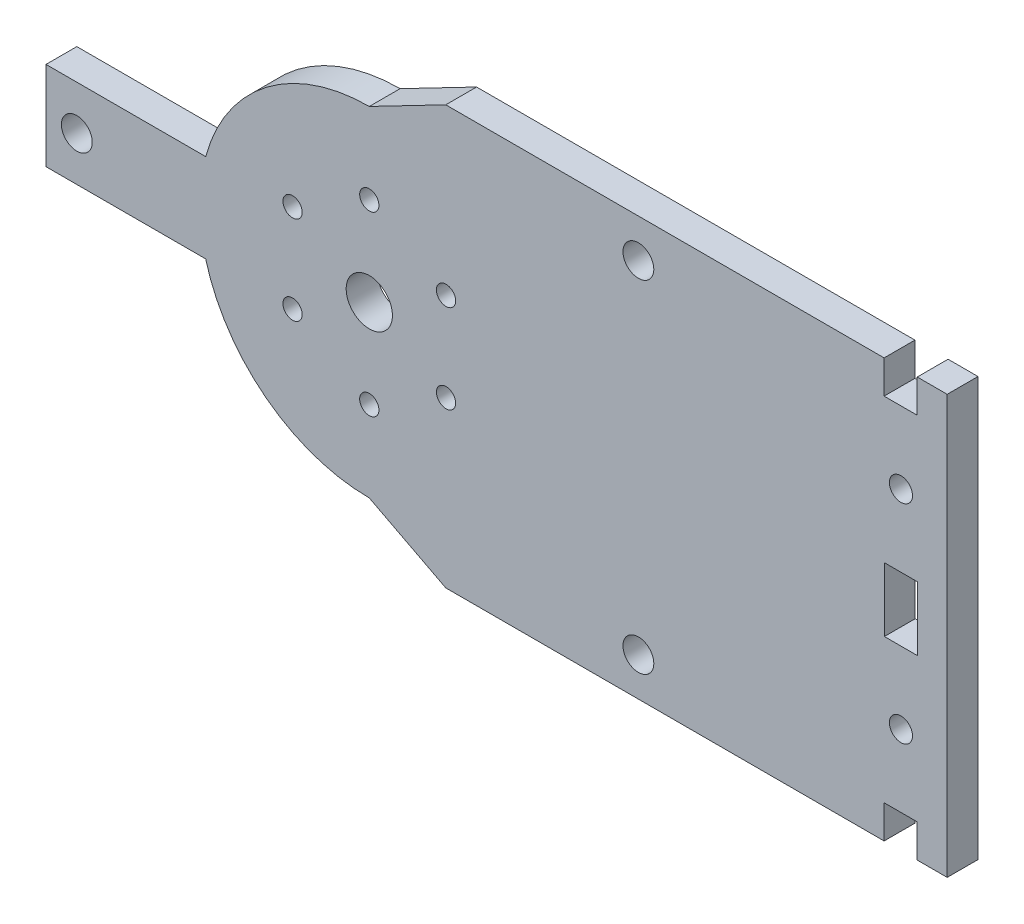
ISO-10303-21;
HEADER;
FILE_DESCRIPTION(('STEP AP214'),'2;1');
FILE_NAME('part.step','',(''),(''),'','','');
FILE_SCHEMA(('AUTOMOTIVE_DESIGN { 1 0 10303 214 1 1 1 1 }'));
ENDSEC;
DATA;
#1=APPLICATION_CONTEXT('core data for automotive mechanical design processes');
#2=APPLICATION_PROTOCOL_DEFINITION('international standard','automotive_design',2000,#1);
#3=PRODUCT_CONTEXT('',#1,'mechanical');
#4=PRODUCT('Part','Part','',(#3));
#5=PRODUCT_RELATED_PRODUCT_CATEGORY('part','',(#4));
#6=PRODUCT_DEFINITION_FORMATION('','',#4);
#7=PRODUCT_DEFINITION_CONTEXT('part definition',#1,'design');
#8=PRODUCT_DEFINITION('design','',#6,#7);
#9=PRODUCT_DEFINITION_SHAPE('','',#8);
#10=(LENGTH_UNIT() NAMED_UNIT(*) SI_UNIT(.MILLI.,.METRE.));
#11=(NAMED_UNIT(*) PLANE_ANGLE_UNIT() SI_UNIT($,.RADIAN.));
#12=(NAMED_UNIT(*) SI_UNIT($,.STERADIAN.) SOLID_ANGLE_UNIT());
#13=UNCERTAINTY_MEASURE_WITH_UNIT(LENGTH_MEASURE(1.E-05),#10,'distance_accuracy_value','');
#14=(GEOMETRIC_REPRESENTATION_CONTEXT(3) GLOBAL_UNCERTAINTY_ASSIGNED_CONTEXT((#13)) GLOBAL_UNIT_ASSIGNED_CONTEXT((#10,
#11,#12)) REPRESENTATION_CONTEXT('',''));
#15=CARTESIAN_POINT('',(0.,0.,0.));
#16=DIRECTION('',(0.,0.,1.));
#17=DIRECTION('',(1.,0.,0.));
#18=AXIS2_PLACEMENT_3D('',#15,#16,#17);
#19=CARTESIAN_POINT('',(-38.9989951683486,0.,4.));
#20=DIRECTION('',(0.,0.,-1.));
#21=DIRECTION('',(-1.,0.,0.));
#22=AXIS2_PLACEMENT_3D('',#19,#20,#21);
#23=PLANE('',#22);
#24=CARTESIAN_POINT('',(30.0010048316515,13.5,4.));
#25=DIRECTION('',(0.,0.,1.));
#26=DIRECTION('',(1.,0.,0.));
#27=AXIS2_PLACEMENT_3D('',#24,#25,#26);
#28=CIRCLE('',#27,1.49999999999999);
#29=CARTESIAN_POINT('',(31.5010048316515,13.5,4.));
#30=VERTEX_POINT('',#29);
#31=EDGE_CURVE('E223',#30,#30,#28,.T.);
#32=ORIENTED_EDGE('',*,*,#31,.F.);
#33=EDGE_LOOP('',(#32));
#34=FACE_BOUND('',#33,.T.);
#35=DIRECTION('',(1.,0.,0.));
#36=VECTOR('',#35,1.);
#37=CARTESIAN_POINT('',(27.8157078564777,-27.1499999999999,4.));
#38=LINE('',#37,#36);
#39=CARTESIAN_POINT('',(-29.0750000000013,-27.1499999999999,4.));
#40=VERTEX_POINT('',#39);
#41=CARTESIAN_POINT('',(27.8157078564777,-27.1499999999999,4.));
#42=VERTEX_POINT('',#41);
#43=EDGE_CURVE('E229',#40,#42,#38,.T.);
#44=ORIENTED_EDGE('',*,*,#43,.T.);
#45=DIRECTION('',(0.,1.,0.));
#46=VECTOR('',#45,1.);
#47=CARTESIAN_POINT('',(27.8157078564777,-27.1499999999999,4.));
#48=LINE('',#47,#46);
#49=CARTESIAN_POINT('',(27.8157078564777,-22.8499999999999,4.));
#50=VERTEX_POINT('',#49);
#51=EDGE_CURVE('E232',#42,#50,#48,.T.);
#52=ORIENTED_EDGE('',*,*,#51,.T.);
#53=DIRECTION('',(1.,0.,0.));
#54=VECTOR('',#53,1.);
#55=CARTESIAN_POINT('',(27.8157078564777,-22.8499999999999,4.));
#56=LINE('',#55,#54);
#57=CARTESIAN_POINT('',(32.1157078564777,-22.8499999999999,4.));
#58=VERTEX_POINT('',#57);
#59=EDGE_CURVE('E235',#50,#58,#56,.T.);
#60=ORIENTED_EDGE('',*,*,#59,.T.);
#61=DIRECTION('',(0.,-1.,0.));
#62=VECTOR('',#61,1.);
#63=CARTESIAN_POINT('',(32.1157078564777,-27.1499999999999,4.));
#64=LINE('',#63,#62);
#65=CARTESIAN_POINT('',(32.1157078564777,-27.1499999999999,4.));
#66=VERTEX_POINT('',#65);
#67=EDGE_CURVE('E237',#58,#66,#64,.T.);
#68=ORIENTED_EDGE('',*,*,#67,.T.);
#69=DIRECTION('',(1.,0.,0.));
#70=VECTOR('',#69,1.);
#71=CARTESIAN_POINT('',(32.1157078564777,-27.1499999999999,4.));
#72=LINE('',#71,#70);
#73=CARTESIAN_POINT('',(36.0010048316514,-27.1499999999999,4.));
#74=VERTEX_POINT('',#73);
#75=EDGE_CURVE('E239',#66,#74,#72,.T.);
#76=ORIENTED_EDGE('',*,*,#75,.T.);
#77=DIRECTION('',(0.,1.,0.));
#78=VECTOR('',#77,1.);
#79=CARTESIAN_POINT('',(36.0010048316514,-27.1499999999999,4.));
#80=LINE('',#79,#78);
#81=CARTESIAN_POINT('',(36.0010048316514,27.1499999999999,4.));
#82=VERTEX_POINT('',#81);
#83=EDGE_CURVE('E241',#74,#82,#80,.T.);
#84=ORIENTED_EDGE('',*,*,#83,.T.);
#85=DIRECTION('',(-1.,0.,0.));
#86=VECTOR('',#85,1.);
#87=CARTESIAN_POINT('',(36.0010048316514,27.1499999999999,4.));
#88=LINE('',#87,#86);
#89=CARTESIAN_POINT('',(32.1157078564777,27.1499999999999,4.));
#90=VERTEX_POINT('',#89);
#91=EDGE_CURVE('E243',#82,#90,#88,.T.);
#92=ORIENTED_EDGE('',*,*,#91,.T.);
#93=DIRECTION('',(0.,-1.,0.));
#94=VECTOR('',#93,1.);
#95=CARTESIAN_POINT('',(32.1157078564777,27.1499999999999,4.));
#96=LINE('',#95,#94);
#97=CARTESIAN_POINT('',(32.1157078564777,22.8499999999999,4.));
#98=VERTEX_POINT('',#97);
#99=EDGE_CURVE('E245',#90,#98,#96,.T.);
#100=ORIENTED_EDGE('',*,*,#99,.T.);
#101=DIRECTION('',(-1.,0.,0.));
#102=VECTOR('',#101,1.);
#103=CARTESIAN_POINT('',(27.8157078564777,22.8499999999999,4.));
#104=LINE('',#103,#102);
#105=CARTESIAN_POINT('',(27.8157078564777,22.8499999999999,4.));
#106=VERTEX_POINT('',#105);
#107=EDGE_CURVE('E247',#98,#106,#104,.T.);
#108=ORIENTED_EDGE('',*,*,#107,.T.);
#109=DIRECTION('',(0.,1.,0.));
#110=VECTOR('',#109,1.);
#111=CARTESIAN_POINT('',(27.8157078564777,27.1499999999999,4.));
#112=LINE('',#111,#110);
#113=CARTESIAN_POINT('',(27.8157078564777,27.1499999999999,4.));
#114=VERTEX_POINT('',#113);
#115=EDGE_CURVE('E249',#106,#114,#112,.T.);
#116=ORIENTED_EDGE('',*,*,#115,.T.);
#117=DIRECTION('',(-1.,0.,0.));
#118=VECTOR('',#117,1.);
#119=CARTESIAN_POINT('',(-29.0750000000013,27.1499999999999,4.));
#120=LINE('',#119,#118);
#121=CARTESIAN_POINT('',(-29.0750000000013,27.1499999999999,4.));
#122=VERTEX_POINT('',#121);
#123=EDGE_CURVE('E251',#114,#122,#120,.T.);
#124=ORIENTED_EDGE('',*,*,#123,.T.);
#125=DIRECTION('',(-0.887673551634124,-0.460473306207059,0.));
#126=VECTOR('',#125,1.);
#127=CARTESIAN_POINT('',(-38.9989951683486,22.0020096633054,4.));
#128=LINE('',#127,#126);
#129=CARTESIAN_POINT('',(-38.9989951683486,22.0020096633054,4.));
#130=VERTEX_POINT('',#129);
#131=EDGE_CURVE('E253',#122,#130,#128,.T.);
#132=ORIENTED_EDGE('',*,*,#131,.T.);
#133=CARTESIAN_POINT('',(-38.9989951683486,0.,4.));
#134=DIRECTION('',(0.,0.,1.));
#135=DIRECTION('',(-1.,0.,0.));
#136=AXIS2_PLACEMENT_3D('',#133,#134,#135);
#137=CIRCLE('',#136,22.0020096633054);
#138=CARTESIAN_POINT('',(-60.2363662209103,5.75000000000001,4.));
#139=VERTEX_POINT('',#138);
#140=EDGE_CURVE('E255',#130,#139,#137,.T.);
#141=ORIENTED_EDGE('',*,*,#140,.T.);
#142=DIRECTION('',(-1.,0.,0.));
#143=VECTOR('',#142,1.);
#144=CARTESIAN_POINT('',(-60.2363662209103,5.75000000000001,4.));
#145=LINE('',#144,#143);
#146=CARTESIAN_POINT('',(-80.9582873118696,5.75,4.));
#147=VERTEX_POINT('',#146);
#148=EDGE_CURVE('E257',#139,#147,#145,.T.);
#149=ORIENTED_EDGE('',*,*,#148,.T.);
#150=DIRECTION('',(0.,-1.,0.));
#151=VECTOR('',#150,1.);
#152=CARTESIAN_POINT('',(-80.9582873118696,5.75,4.));
#153=LINE('',#152,#151);
#154=CARTESIAN_POINT('',(-80.9582873118696,-5.75,4.));
#155=VERTEX_POINT('',#154);
#156=EDGE_CURVE('E259',#147,#155,#153,.T.);
#157=ORIENTED_EDGE('',*,*,#156,.T.);
#158=DIRECTION('',(1.,0.,0.));
#159=VECTOR('',#158,1.);
#160=CARTESIAN_POINT('',(-80.9582873118696,-5.75,4.));
#161=LINE('',#160,#159);
#162=CARTESIAN_POINT('',(-60.2363662209103,-5.75000000000001,4.));
#163=VERTEX_POINT('',#162);
#164=EDGE_CURVE('E261',#155,#163,#161,.T.);
#165=ORIENTED_EDGE('',*,*,#164,.T.);
#166=CARTESIAN_POINT('',(-38.9989951683486,0.,4.));
#167=DIRECTION('',(0.,0.,1.));
#168=DIRECTION('',(-1.,0.,0.));
#169=AXIS2_PLACEMENT_3D('',#166,#167,#168);
#170=CIRCLE('',#169,22.0020096633054);
#171=CARTESIAN_POINT('',(-38.9989951683486,-22.0020096633054,4.));
#172=VERTEX_POINT('',#171);
#173=EDGE_CURVE('E263',#163,#172,#170,.T.);
#174=ORIENTED_EDGE('',*,*,#173,.T.);
#175=DIRECTION('',(0.887673551634124,-0.46047330620706,0.));
#176=VECTOR('',#175,1.);
#177=CARTESIAN_POINT('',(-38.9989951683486,-22.0020096633054,4.));
#178=LINE('',#177,#176);
#179=EDGE_CURVE('E265',#172,#40,#178,.T.);
#180=ORIENTED_EDGE('',*,*,#179,.T.);
#181=EDGE_LOOP('',(#44,#52,#60,#68,#76,#84,#92,#100,#108,#116,#124,#132,#141,#149,#157,#165,
#174,#180));
#182=FACE_BOUND('',#181,.T.);
#183=DIRECTION('',(0.,-1.,0.));
#184=VECTOR('',#183,1.);
#185=CARTESIAN_POINT('',(27.8510048316515,-4.15,4.));
#186=LINE('',#185,#184);
#187=CARTESIAN_POINT('',(27.8510048316515,4.15,4.));
#188=VERTEX_POINT('',#187);
#189=CARTESIAN_POINT('',(27.8510048316515,-4.15,4.));
#190=VERTEX_POINT('',#189);
#191=EDGE_CURVE('E184',#188,#190,#186,.T.);
#192=ORIENTED_EDGE('',*,*,#191,.F.);
#193=DIRECTION('',(-1.,0.,0.));
#194=VECTOR('',#193,1.);
#195=CARTESIAN_POINT('',(32.1510048316515,4.15,4.));
#196=LINE('',#195,#194);
#197=CARTESIAN_POINT('',(32.1510048316515,4.15,4.));
#198=VERTEX_POINT('',#197);
#199=EDGE_CURVE('E207',#198,#188,#196,.T.);
#200=ORIENTED_EDGE('',*,*,#199,.F.);
#201=DIRECTION('',(0.,1.,0.));
#202=VECTOR('',#201,1.);
#203=CARTESIAN_POINT('',(32.1510048316515,-4.15,4.));
#204=LINE('',#203,#202);
#205=CARTESIAN_POINT('',(32.1510048316515,-4.15,4.));
#206=VERTEX_POINT('',#205);
#207=EDGE_CURVE('E205',#206,#198,#204,.T.);
#208=ORIENTED_EDGE('',*,*,#207,.F.);
#209=DIRECTION('',(1.,0.,0.));
#210=VECTOR('',#209,1.);
#211=CARTESIAN_POINT('',(32.1510048316515,-4.15,4.));
#212=LINE('',#211,#210);
#213=EDGE_CURVE('E192',#190,#206,#212,.T.);
#214=ORIENTED_EDGE('',*,*,#213,.F.);
#215=EDGE_LOOP('',(#192,#200,#208,#214));
#216=FACE_BOUND('',#215,.T.);
#217=CARTESIAN_POINT('',(30.0010048316515,-13.5,4.));
#218=DIRECTION('',(0.,0.,1.));
#219=DIRECTION('',(-1.,0.,0.));
#220=AXIS2_PLACEMENT_3D('',#217,#218,#219);
#221=CIRCLE('',#220,1.49999999999999);
#222=CARTESIAN_POINT('',(28.5010048316515,-13.5,4.));
#223=VERTEX_POINT('',#222);
#224=EDGE_CURVE('E213',#223,#223,#221,.T.);
#225=ORIENTED_EDGE('',*,*,#224,.F.);
#226=EDGE_LOOP('',(#225));
#227=FACE_BOUND('',#226,.T.);
#228=CARTESIAN_POINT('',(-38.9989951683486,0.,4.));
#229=DIRECTION('',(0.,0.,1.));
#230=DIRECTION('',(1.,0.,0.));
#231=AXIS2_PLACEMENT_3D('',#228,#229,#230);
#232=CIRCLE('',#231,3.);
#233=CARTESIAN_POINT('',(-35.9989951683486,0.,4.));
#234=VERTEX_POINT('',#233);
#235=EDGE_CURVE('E817',#234,#234,#232,.T.);
#236=ORIENTED_EDGE('',*,*,#235,.F.);
#237=EDGE_LOOP('',(#236));
#238=FACE_BOUND('',#237,.T.);
#239=CARTESIAN_POINT('',(-38.9989951683486,-11.5,4.));
#240=DIRECTION('',(0.,0.,1.));
#241=DIRECTION('',(1.,0.,0.));
#242=AXIS2_PLACEMENT_3D('',#239,#240,#241);
#243=CIRCLE('',#242,1.25);
#244=CARTESIAN_POINT('',(-37.7489951683486,-11.5,4.));
#245=VERTEX_POINT('',#244);
#246=EDGE_CURVE('E811',#245,#245,#243,.T.);
#247=ORIENTED_EDGE('',*,*,#246,.F.);
#248=EDGE_LOOP('',(#247));
#249=FACE_BOUND('',#248,.T.);
#250=CARTESIAN_POINT('',(-4.07500000000129,-22.1499999999999,4.));
#251=DIRECTION('',(0.,0.,1.));
#252=DIRECTION('',(1.,0.,0.));
#253=AXIS2_PLACEMENT_3D('',#250,#251,#252);
#254=CIRCLE('',#253,2.);
#255=CARTESIAN_POINT('',(-2.07500000000129,-22.1499999999999,4.));
#256=VERTEX_POINT('',#255);
#257=EDGE_CURVE('E805',#256,#256,#254,.T.);
#258=ORIENTED_EDGE('',*,*,#257,.F.);
#259=EDGE_LOOP('',(#258));
#260=FACE_BOUND('',#259,.T.);
#261=CARTESIAN_POINT('',(-48.9582873118696,-5.75,4.));
#262=DIRECTION('',(0.,0.,1.));
#263=DIRECTION('',(1.,0.,0.));
#264=AXIS2_PLACEMENT_3D('',#261,#262,#263);
#265=CIRCLE('',#264,1.25);
#266=CARTESIAN_POINT('',(-47.7082873118696,-5.75,4.));
#267=VERTEX_POINT('',#266);
#268=EDGE_CURVE('E799',#267,#267,#265,.T.);
#269=ORIENTED_EDGE('',*,*,#268,.F.);
#270=EDGE_LOOP('',(#269));
#271=FACE_BOUND('',#270,.T.);
#272=CARTESIAN_POINT('',(-48.9582873118696,5.75000000000001,4.));
#273=DIRECTION('',(0.,0.,1.));
#274=DIRECTION('',(1.,0.,0.));
#275=AXIS2_PLACEMENT_3D('',#272,#273,#274);
#276=CIRCLE('',#275,1.25);
#277=CARTESIAN_POINT('',(-47.7082873118696,5.75000000000001,4.));
#278=VERTEX_POINT('',#277);
#279=EDGE_CURVE('E793',#278,#278,#276,.T.);
#280=ORIENTED_EDGE('',*,*,#279,.F.);
#281=EDGE_LOOP('',(#280));
#282=FACE_BOUND('',#281,.T.);
#283=CARTESIAN_POINT('',(-38.9989951683486,11.5,4.));
#284=DIRECTION('',(0.,0.,1.));
#285=DIRECTION('',(1.,0.,0.));
#286=AXIS2_PLACEMENT_3D('',#283,#284,#285);
#287=CIRCLE('',#286,1.25);
#288=CARTESIAN_POINT('',(-37.7489951683486,11.5,4.));
#289=VERTEX_POINT('',#288);
#290=EDGE_CURVE('E787',#289,#289,#287,.T.);
#291=ORIENTED_EDGE('',*,*,#290,.F.);
#292=EDGE_LOOP('',(#291));
#293=FACE_BOUND('',#292,.T.);
#294=CARTESIAN_POINT('',(-29.0397030248275,5.75000000000001,4.));
#295=DIRECTION('',(0.,0.,1.));
#296=DIRECTION('',(1.,0.,0.));
#297=AXIS2_PLACEMENT_3D('',#294,#295,#296);
#298=CIRCLE('',#297,1.25);
#299=CARTESIAN_POINT('',(-27.7897030248275,5.75000000000001,4.));
#300=VERTEX_POINT('',#299);
#301=EDGE_CURVE('E781',#300,#300,#298,.T.);
#302=ORIENTED_EDGE('',*,*,#301,.F.);
#303=EDGE_LOOP('',(#302));
#304=FACE_BOUND('',#303,.T.);
#305=CARTESIAN_POINT('',(-29.0397030248275,-5.75000000000001,4.));
#306=DIRECTION('',(0.,0.,1.));
#307=DIRECTION('',(1.,0.,0.));
#308=AXIS2_PLACEMENT_3D('',#305,#306,#307);
#309=CIRCLE('',#308,1.25);
#310=CARTESIAN_POINT('',(-27.7897030248275,-5.75000000000001,4.));
#311=VERTEX_POINT('',#310);
#312=EDGE_CURVE('E775',#311,#311,#309,.T.);
#313=ORIENTED_EDGE('',*,*,#312,.F.);
#314=EDGE_LOOP('',(#313));
#315=FACE_BOUND('',#314,.T.);
#316=CARTESIAN_POINT('',(-4.07500000000129,22.1499999999999,4.));
#317=DIRECTION('',(0.,0.,1.));
#318=DIRECTION('',(1.,0.,0.));
#319=AXIS2_PLACEMENT_3D('',#316,#317,#318);
#320=CIRCLE('',#319,2.);
#321=CARTESIAN_POINT('',(-2.07500000000129,22.1499999999999,4.));
#322=VERTEX_POINT('',#321);
#323=EDGE_CURVE('E769',#322,#322,#320,.T.);
#324=ORIENTED_EDGE('',*,*,#323,.F.);
#325=EDGE_LOOP('',(#324));
#326=FACE_BOUND('',#325,.T.);
#327=CARTESIAN_POINT('',(-76.9582873118696,0.,4.));
#328=DIRECTION('',(0.,0.,1.));
#329=DIRECTION('',(1.,0.,0.));
#330=AXIS2_PLACEMENT_3D('',#327,#328,#329);
#331=CIRCLE('',#330,2.);
#332=CARTESIAN_POINT('',(-74.9582873118696,0.,4.));
#333=VERTEX_POINT('',#332);
#334=EDGE_CURVE('E760',#333,#333,#331,.T.);
#335=ORIENTED_EDGE('',*,*,#334,.F.);
#336=EDGE_LOOP('',(#335));
#337=FACE_BOUND('',#336,.T.);
#338=ADVANCED_FACE('F35',(#34,#182,#216,#227,#238,#249,#260,#271,#282,#293,#304,#315,#326,#337),
#23,.F.);
#339=CARTESIAN_POINT('',(-38.9989951683486,0.,0.));
#340=DIRECTION('',(0.,0.,-1.));
#341=DIRECTION('',(-1.,0.,0.));
#342=AXIS2_PLACEMENT_3D('',#339,#340,#341);
#343=PLANE('',#342);
#344=CARTESIAN_POINT('',(-4.07500000000129,22.1499999999999,0.));
#345=DIRECTION('',(0.,0.,1.));
#346=DIRECTION('',(1.,0.,0.));
#347=AXIS2_PLACEMENT_3D('',#344,#345,#346);
#348=CIRCLE('',#347,2.);
#349=CARTESIAN_POINT('',(-2.07500000000129,22.1499999999999,0.));
#350=VERTEX_POINT('',#349);
#351=EDGE_CURVE('E766',#350,#350,#348,.T.);
#352=ORIENTED_EDGE('',*,*,#351,.T.);
#353=EDGE_LOOP('',(#352));
#354=FACE_BOUND('',#353,.T.);
#355=CARTESIAN_POINT('',(-29.0397030248275,5.75000000000001,0.));
#356=DIRECTION('',(0.,0.,1.));
#357=DIRECTION('',(1.,0.,0.));
#358=AXIS2_PLACEMENT_3D('',#355,#356,#357);
#359=CIRCLE('',#358,1.25);
#360=CARTESIAN_POINT('',(-27.7897030248275,5.75000000000001,0.));
#361=VERTEX_POINT('',#360);
#362=EDGE_CURVE('E778',#361,#361,#359,.T.);
#363=ORIENTED_EDGE('',*,*,#362,.T.);
#364=EDGE_LOOP('',(#363));
#365=FACE_BOUND('',#364,.T.);
#366=CARTESIAN_POINT('',(-48.9582873118696,5.75000000000001,0.));
#367=DIRECTION('',(0.,0.,1.));
#368=DIRECTION('',(1.,0.,0.));
#369=AXIS2_PLACEMENT_3D('',#366,#367,#368);
#370=CIRCLE('',#369,1.25);
#371=CARTESIAN_POINT('',(-47.7082873118696,5.75000000000001,0.));
#372=VERTEX_POINT('',#371);
#373=EDGE_CURVE('E790',#372,#372,#370,.T.);
#374=ORIENTED_EDGE('',*,*,#373,.T.);
#375=EDGE_LOOP('',(#374));
#376=FACE_BOUND('',#375,.T.);
#377=CARTESIAN_POINT('',(-4.07500000000129,-22.1499999999999,0.));
#378=DIRECTION('',(0.,0.,1.));
#379=DIRECTION('',(1.,0.,0.));
#380=AXIS2_PLACEMENT_3D('',#377,#378,#379);
#381=CIRCLE('',#380,2.);
#382=CARTESIAN_POINT('',(-2.07500000000129,-22.1499999999999,0.));
#383=VERTEX_POINT('',#382);
#384=EDGE_CURVE('E802',#383,#383,#381,.T.);
#385=ORIENTED_EDGE('',*,*,#384,.T.);
#386=EDGE_LOOP('',(#385));
#387=FACE_BOUND('',#386,.T.);
#388=CARTESIAN_POINT('',(-38.9989951683486,0.,0.));
#389=DIRECTION('',(0.,0.,1.));
#390=DIRECTION('',(1.,0.,0.));
#391=AXIS2_PLACEMENT_3D('',#388,#389,#390);
#392=CIRCLE('',#391,3.);
#393=CARTESIAN_POINT('',(-35.9989951683486,0.,0.));
#394=VERTEX_POINT('',#393);
#395=EDGE_CURVE('E814',#394,#394,#392,.T.);
#396=ORIENTED_EDGE('',*,*,#395,.T.);
#397=EDGE_LOOP('',(#396));
#398=FACE_BOUND('',#397,.T.);
#399=DIRECTION('',(-1.,0.,0.));
#400=VECTOR('',#399,1.);
#401=CARTESIAN_POINT('',(32.1510048316515,4.15,0.));
#402=LINE('',#401,#400);
#403=CARTESIAN_POINT('',(32.1510048316515,4.15,0.));
#404=VERTEX_POINT('',#403);
#405=CARTESIAN_POINT('',(27.8510048316515,4.15,0.));
#406=VERTEX_POINT('',#405);
#407=EDGE_CURVE('E193',#404,#406,#402,.T.);
#408=ORIENTED_EDGE('',*,*,#407,.T.);
#409=DIRECTION('',(0.,-1.,0.));
#410=VECTOR('',#409,1.);
#411=CARTESIAN_POINT('',(27.8510048316515,-4.15,0.));
#412=LINE('',#411,#410);
#413=CARTESIAN_POINT('',(27.8510048316515,-4.15,0.));
#414=VERTEX_POINT('',#413);
#415=EDGE_CURVE('E58',#406,#414,#412,.T.);
#416=ORIENTED_EDGE('',*,*,#415,.T.);
#417=DIRECTION('',(1.,0.,0.));
#418=VECTOR('',#417,1.);
#419=CARTESIAN_POINT('',(32.1510048316515,-4.15,0.));
#420=LINE('',#419,#418);
#421=CARTESIAN_POINT('',(32.1510048316515,-4.15,0.));
#422=VERTEX_POINT('',#421);
#423=EDGE_CURVE('E199',#414,#422,#420,.T.);
#424=ORIENTED_EDGE('',*,*,#423,.T.);
#425=DIRECTION('',(0.,1.,0.));
#426=VECTOR('',#425,1.);
#427=CARTESIAN_POINT('',(32.1510048316515,-4.15,0.));
#428=LINE('',#427,#426);
#429=EDGE_CURVE('E215',#422,#404,#428,.T.);
#430=ORIENTED_EDGE('',*,*,#429,.T.);
#431=EDGE_LOOP('',(#408,#416,#424,#430));
#432=FACE_BOUND('',#431,.T.);
#433=CARTESIAN_POINT('',(30.0010048316515,13.5,0.));
#434=DIRECTION('',(0.,0.,1.));
#435=DIRECTION('',(1.,0.,0.));
#436=AXIS2_PLACEMENT_3D('',#433,#434,#435);
#437=CIRCLE('',#436,1.49999999999999);
#438=CARTESIAN_POINT('',(31.5010048316515,13.5,0.));
#439=VERTEX_POINT('',#438);
#440=EDGE_CURVE('E200',#439,#439,#437,.T.);
#441=ORIENTED_EDGE('',*,*,#440,.T.);
#442=EDGE_LOOP('',(#441));
#443=FACE_BOUND('',#442,.T.);
#444=DIRECTION('',(1.,0.,0.));
#445=VECTOR('',#444,1.);
#446=CARTESIAN_POINT('',(27.8157078564777,-27.1499999999999,0.));
#447=LINE('',#446,#445);
#448=CARTESIAN_POINT('',(-29.0750000000013,-27.1499999999999,0.));
#449=VERTEX_POINT('',#448);
#450=CARTESIAN_POINT('',(27.8157078564777,-27.1499999999999,0.));
#451=VERTEX_POINT('',#450);
#452=EDGE_CURVE('E226',#449,#451,#447,.T.);
#453=ORIENTED_EDGE('',*,*,#452,.F.);
#454=DIRECTION('',(0.887673551634124,-0.46047330620706,0.));
#455=VECTOR('',#454,1.);
#456=CARTESIAN_POINT('',(-38.9989951683486,-22.0020096633054,0.));
#457=LINE('',#456,#455);
#458=CARTESIAN_POINT('',(-38.9989951683486,-22.0020096633054,0.));
#459=VERTEX_POINT('',#458);
#460=EDGE_CURVE('E233',#459,#449,#457,.T.);
#461=ORIENTED_EDGE('',*,*,#460,.F.);
#462=CARTESIAN_POINT('',(-38.9989951683486,0.,0.));
#463=DIRECTION('',(0.,0.,1.));
#464=DIRECTION('',(-1.,0.,0.));
#465=AXIS2_PLACEMENT_3D('',#462,#463,#464);
#466=CIRCLE('',#465,22.0020096633054);
#467=CARTESIAN_POINT('',(-60.2363662209103,-5.75000000000001,0.));
#468=VERTEX_POINT('',#467);
#469=EDGE_CURVE('E300',#468,#459,#466,.T.);
#470=ORIENTED_EDGE('',*,*,#469,.F.);
#471=DIRECTION('',(1.,0.,0.));
#472=VECTOR('',#471,1.);
#473=CARTESIAN_POINT('',(-80.9582873118696,-5.75,0.));
#474=LINE('',#473,#472);
#475=CARTESIAN_POINT('',(-80.9582873118696,-5.75,0.));
#476=VERTEX_POINT('',#475);
#477=EDGE_CURVE('E298',#476,#468,#474,.T.);
#478=ORIENTED_EDGE('',*,*,#477,.F.);
#479=DIRECTION('',(0.,-1.,0.));
#480=VECTOR('',#479,1.);
#481=CARTESIAN_POINT('',(-80.9582873118696,5.75,0.));
#482=LINE('',#481,#480);
#483=CARTESIAN_POINT('',(-80.9582873118696,5.75,0.));
#484=VERTEX_POINT('',#483);
#485=EDGE_CURVE('E296',#484,#476,#482,.T.);
#486=ORIENTED_EDGE('',*,*,#485,.F.);
#487=DIRECTION('',(-1.,0.,0.));
#488=VECTOR('',#487,1.);
#489=CARTESIAN_POINT('',(-60.2363662209103,5.75000000000001,0.));
#490=LINE('',#489,#488);
#491=CARTESIAN_POINT('',(-60.2363662209103,5.75000000000001,0.));
#492=VERTEX_POINT('',#491);
#493=EDGE_CURVE('E294',#492,#484,#490,.T.);
#494=ORIENTED_EDGE('',*,*,#493,.F.);
#495=CARTESIAN_POINT('',(-38.9989951683486,0.,0.));
#496=DIRECTION('',(0.,0.,1.));
#497=DIRECTION('',(-1.,0.,0.));
#498=AXIS2_PLACEMENT_3D('',#495,#496,#497);
#499=CIRCLE('',#498,22.0020096633054);
#500=CARTESIAN_POINT('',(-38.9989951683486,22.0020096633054,0.));
#501=VERTEX_POINT('',#500);
#502=EDGE_CURVE('E292',#501,#492,#499,.T.);
#503=ORIENTED_EDGE('',*,*,#502,.F.);
#504=DIRECTION('',(-0.887673551634124,-0.460473306207059,0.));
#505=VECTOR('',#504,1.);
#506=CARTESIAN_POINT('',(-38.9989951683486,22.0020096633054,0.));
#507=LINE('',#506,#505);
#508=CARTESIAN_POINT('',(-29.0750000000013,27.1499999999999,0.));
#509=VERTEX_POINT('',#508);
#510=EDGE_CURVE('E290',#509,#501,#507,.T.);
#511=ORIENTED_EDGE('',*,*,#510,.F.);
#512=DIRECTION('',(-1.,0.,0.));
#513=VECTOR('',#512,1.);
#514=CARTESIAN_POINT('',(-29.0750000000013,27.1499999999999,0.));
#515=LINE('',#514,#513);
#516=CARTESIAN_POINT('',(27.8157078564777,27.1499999999999,0.));
#517=VERTEX_POINT('',#516);
#518=EDGE_CURVE('E288',#517,#509,#515,.T.);
#519=ORIENTED_EDGE('',*,*,#518,.F.);
#520=DIRECTION('',(0.,1.,0.));
#521=VECTOR('',#520,1.);
#522=CARTESIAN_POINT('',(27.8157078564777,27.1499999999999,0.));
#523=LINE('',#522,#521);
#524=CARTESIAN_POINT('',(27.8157078564777,22.8499999999999,0.));
#525=VERTEX_POINT('',#524);
#526=EDGE_CURVE('E286',#525,#517,#523,.T.);
#527=ORIENTED_EDGE('',*,*,#526,.F.);
#528=DIRECTION('',(-1.,0.,0.));
#529=VECTOR('',#528,1.);
#530=CARTESIAN_POINT('',(27.8157078564777,22.8499999999999,0.));
#531=LINE('',#530,#529);
#532=CARTESIAN_POINT('',(32.1157078564777,22.8499999999999,0.));
#533=VERTEX_POINT('',#532);
#534=EDGE_CURVE('E284',#533,#525,#531,.T.);
#535=ORIENTED_EDGE('',*,*,#534,.F.);
#536=DIRECTION('',(0.,-1.,0.));
#537=VECTOR('',#536,1.);
#538=CARTESIAN_POINT('',(32.1157078564777,27.1499999999999,0.));
#539=LINE('',#538,#537);
#540=CARTESIAN_POINT('',(32.1157078564777,27.1499999999999,0.));
#541=VERTEX_POINT('',#540);
#542=EDGE_CURVE('E282',#541,#533,#539,.T.);
#543=ORIENTED_EDGE('',*,*,#542,.F.);
#544=DIRECTION('',(-1.,0.,0.));
#545=VECTOR('',#544,1.);
#546=CARTESIAN_POINT('',(36.0010048316514,27.1499999999999,0.));
#547=LINE('',#546,#545);
#548=CARTESIAN_POINT('',(36.0010048316514,27.1499999999999,0.));
#549=VERTEX_POINT('',#548);
#550=EDGE_CURVE('E280',#549,#541,#547,.T.);
#551=ORIENTED_EDGE('',*,*,#550,.F.);
#552=DIRECTION('',(0.,1.,0.));
#553=VECTOR('',#552,1.);
#554=CARTESIAN_POINT('',(36.0010048316514,-27.1499999999999,0.));
#555=LINE('',#554,#553);
#556=CARTESIAN_POINT('',(36.0010048316514,-27.1499999999999,0.));
#557=VERTEX_POINT('',#556);
#558=EDGE_CURVE('E278',#557,#549,#555,.T.);
#559=ORIENTED_EDGE('',*,*,#558,.F.);
#560=DIRECTION('',(1.,0.,0.));
#561=VECTOR('',#560,1.);
#562=CARTESIAN_POINT('',(32.1157078564777,-27.1499999999999,0.));
#563=LINE('',#562,#561);
#564=CARTESIAN_POINT('',(32.1157078564777,-27.1499999999999,0.));
#565=VERTEX_POINT('',#564);
#566=EDGE_CURVE('E276',#565,#557,#563,.T.);
#567=ORIENTED_EDGE('',*,*,#566,.F.);
#568=DIRECTION('',(0.,-1.,0.));
#569=VECTOR('',#568,1.);
#570=CARTESIAN_POINT('',(32.1157078564777,-27.1499999999999,0.));
#571=LINE('',#570,#569);
#572=CARTESIAN_POINT('',(32.1157078564777,-22.8499999999999,0.));
#573=VERTEX_POINT('',#572);
#574=EDGE_CURVE('E274',#573,#565,#571,.T.);
#575=ORIENTED_EDGE('',*,*,#574,.F.);
#576=DIRECTION('',(1.,0.,0.));
#577=VECTOR('',#576,1.);
#578=CARTESIAN_POINT('',(27.8157078564777,-22.8499999999999,0.));
#579=LINE('',#578,#577);
#580=CARTESIAN_POINT('',(27.8157078564777,-22.8499999999999,0.));
#581=VERTEX_POINT('',#580);
#582=EDGE_CURVE('E272',#581,#573,#579,.T.);
#583=ORIENTED_EDGE('',*,*,#582,.F.);
#584=DIRECTION('',(0.,1.,0.));
#585=VECTOR('',#584,1.);
#586=CARTESIAN_POINT('',(27.8157078564777,-27.1499999999999,0.));
#587=LINE('',#586,#585);
#588=EDGE_CURVE('E270',#451,#581,#587,.T.);
#589=ORIENTED_EDGE('',*,*,#588,.F.);
#590=EDGE_LOOP('',(#453,#461,#470,#478,#486,#494,#503,#511,#519,#527,#535,#543,#551,#559,#567,
#575,#583,#589));
#591=FACE_BOUND('',#590,.T.);
#592=CARTESIAN_POINT('',(30.0010048316515,-13.5,0.));
#593=DIRECTION('',(0.,0.,1.));
#594=DIRECTION('',(-1.,0.,0.));
#595=AXIS2_PLACEMENT_3D('',#592,#593,#594);
#596=CIRCLE('',#595,1.49999999999999);
#597=CARTESIAN_POINT('',(28.5010048316515,-13.5,0.));
#598=VERTEX_POINT('',#597);
#599=EDGE_CURVE('E820',#598,#598,#596,.T.);
#600=ORIENTED_EDGE('',*,*,#599,.T.);
#601=EDGE_LOOP('',(#600));
#602=FACE_BOUND('',#601,.T.);
#603=CARTESIAN_POINT('',(-38.9989951683486,-11.5,0.));
#604=DIRECTION('',(0.,0.,1.));
#605=DIRECTION('',(1.,0.,0.));
#606=AXIS2_PLACEMENT_3D('',#603,#604,#605);
#607=CIRCLE('',#606,1.25);
#608=CARTESIAN_POINT('',(-37.7489951683486,-11.5,0.));
#609=VERTEX_POINT('',#608);
#610=EDGE_CURVE('E808',#609,#609,#607,.T.);
#611=ORIENTED_EDGE('',*,*,#610,.T.);
#612=EDGE_LOOP('',(#611));
#613=FACE_BOUND('',#612,.T.);
#614=CARTESIAN_POINT('',(-48.9582873118696,-5.75,0.));
#615=DIRECTION('',(0.,0.,1.));
#616=DIRECTION('',(1.,0.,0.));
#617=AXIS2_PLACEMENT_3D('',#614,#615,#616);
#618=CIRCLE('',#617,1.25);
#619=CARTESIAN_POINT('',(-47.7082873118696,-5.75,0.));
#620=VERTEX_POINT('',#619);
#621=EDGE_CURVE('E796',#620,#620,#618,.T.);
#622=ORIENTED_EDGE('',*,*,#621,.T.);
#623=EDGE_LOOP('',(#622));
#624=FACE_BOUND('',#623,.T.);
#625=CARTESIAN_POINT('',(-38.9989951683486,11.5,0.));
#626=DIRECTION('',(0.,0.,1.));
#627=DIRECTION('',(1.,0.,0.));
#628=AXIS2_PLACEMENT_3D('',#625,#626,#627);
#629=CIRCLE('',#628,1.25);
#630=CARTESIAN_POINT('',(-37.7489951683486,11.5,0.));
#631=VERTEX_POINT('',#630);
#632=EDGE_CURVE('E784',#631,#631,#629,.T.);
#633=ORIENTED_EDGE('',*,*,#632,.T.);
#634=EDGE_LOOP('',(#633));
#635=FACE_BOUND('',#634,.T.);
#636=CARTESIAN_POINT('',(-29.0397030248275,-5.75000000000001,0.));
#637=DIRECTION('',(0.,0.,1.));
#638=DIRECTION('',(1.,0.,0.));
#639=AXIS2_PLACEMENT_3D('',#636,#637,#638);
#640=CIRCLE('',#639,1.25);
#641=CARTESIAN_POINT('',(-27.7897030248275,-5.75000000000001,0.));
#642=VERTEX_POINT('',#641);
#643=EDGE_CURVE('E772',#642,#642,#640,.T.);
#644=ORIENTED_EDGE('',*,*,#643,.T.);
#645=EDGE_LOOP('',(#644));
#646=FACE_BOUND('',#645,.T.);
#647=CARTESIAN_POINT('',(-76.9582873118696,0.,0.));
#648=DIRECTION('',(0.,0.,1.));
#649=DIRECTION('',(1.,0.,0.));
#650=AXIS2_PLACEMENT_3D('',#647,#648,#649);
#651=CIRCLE('',#650,2.);
#652=CARTESIAN_POINT('',(-74.9582873118696,0.,0.));
#653=VERTEX_POINT('',#652);
#654=EDGE_CURVE('E763',#653,#653,#651,.T.);
#655=ORIENTED_EDGE('',*,*,#654,.T.);
#656=EDGE_LOOP('',(#655));
#657=FACE_BOUND('',#656,.T.);
#658=ADVANCED_FACE('F360',(#354,#365,#376,#387,#398,#432,#443,#591,#602,#613,#624,#635,#646,
#657),#343,.T.);
#659=CARTESIAN_POINT('',(27.8157078564777,-27.1499999999999,4.));
#660=DIRECTION('',(0.,1.,0.));
#661=DIRECTION('',(-1.,0.,0.));
#662=AXIS2_PLACEMENT_3D('',#659,#660,#661);
#663=PLANE('',#662);
#664=ORIENTED_EDGE('',*,*,#452,.T.);
#665=DIRECTION('',(0.,0.,-1.));
#666=VECTOR('',#665,1.);
#667=CARTESIAN_POINT('',(27.8157078564777,-27.1499999999999,4.));
#668=LINE('',#667,#666);
#669=EDGE_CURVE('E11',#42,#451,#668,.T.);
#670=ORIENTED_EDGE('',*,*,#669,.F.);
#671=ORIENTED_EDGE('',*,*,#43,.F.);
#672=DIRECTION('',(0.,0.,-1.));
#673=VECTOR('',#672,1.);
#674=CARTESIAN_POINT('',(-29.0750000000013,-27.1499999999999,4.));
#675=LINE('',#674,#673);
#676=EDGE_CURVE('E267',#40,#449,#675,.T.);
#677=ORIENTED_EDGE('',*,*,#676,.T.);
#678=EDGE_LOOP('',(#664,#670,#671,#677));
#679=FACE_BOUND('',#678,.T.);
#680=ADVANCED_FACE('F37',(#679),#663,.F.);
#681=CARTESIAN_POINT('',(27.8157078564777,-27.1499999999999,4.));
#682=DIRECTION('',(-1.,0.,0.));
#683=DIRECTION('',(0.,0.,1.));
#684=AXIS2_PLACEMENT_3D('',#681,#682,#683);
#685=PLANE('',#684);
#686=ORIENTED_EDGE('',*,*,#588,.T.);
#687=DIRECTION('',(0.,0.,-1.));
#688=VECTOR('',#687,1.);
#689=CARTESIAN_POINT('',(27.8157078564777,-22.8499999999999,4.));
#690=LINE('',#689,#688);
#691=EDGE_CURVE('E43',#50,#581,#690,.T.);
#692=ORIENTED_EDGE('',*,*,#691,.F.);
#693=ORIENTED_EDGE('',*,*,#51,.F.);
#694=ORIENTED_EDGE('',*,*,#669,.T.);
#695=EDGE_LOOP('',(#686,#692,#693,#694));
#696=FACE_BOUND('',#695,.T.);
#697=ADVANCED_FACE('F377',(#696),#685,.F.);
#698=CARTESIAN_POINT('',(27.8157078564777,-22.8499999999999,4.));
#699=DIRECTION('',(0.,1.,0.));
#700=DIRECTION('',(0.,0.,1.));
#701=AXIS2_PLACEMENT_3D('',#698,#699,#700);
#702=PLANE('',#701);
#703=ORIENTED_EDGE('',*,*,#582,.T.);
#704=DIRECTION('',(0.,0.,-1.));
#705=VECTOR('',#704,1.);
#706=CARTESIAN_POINT('',(32.1157078564777,-22.8499999999999,4.));
#707=LINE('',#706,#705);
#708=EDGE_CURVE('E347',#58,#573,#707,.T.);
#709=ORIENTED_EDGE('',*,*,#708,.F.);
#710=ORIENTED_EDGE('',*,*,#59,.F.);
#711=ORIENTED_EDGE('',*,*,#691,.T.);
#712=EDGE_LOOP('',(#703,#709,#710,#711));
#713=FACE_BOUND('',#712,.T.);
#714=ADVANCED_FACE('F354',(#713),#702,.F.);
#715=CARTESIAN_POINT('',(32.1157078564777,-27.1499999999999,4.));
#716=DIRECTION('',(1.,0.,0.));
#717=DIRECTION('',(0.,0.,-1.));
#718=AXIS2_PLACEMENT_3D('',#715,#716,#717);
#719=PLANE('',#718);
#720=ORIENTED_EDGE('',*,*,#574,.T.);
#721=DIRECTION('',(0.,0.,-1.));
#722=VECTOR('',#721,1.);
#723=CARTESIAN_POINT('',(32.1157078564777,-27.1499999999999,4.));
#724=LINE('',#723,#722);
#725=EDGE_CURVE('E344',#66,#565,#724,.T.);
#726=ORIENTED_EDGE('',*,*,#725,.F.);
#727=ORIENTED_EDGE('',*,*,#67,.F.);
#728=ORIENTED_EDGE('',*,*,#708,.T.);
#729=EDGE_LOOP('',(#720,#726,#727,#728));
#730=FACE_BOUND('',#729,.T.);
#731=ADVANCED_FACE('F366',(#730),#719,.F.);
#732=CARTESIAN_POINT('',(32.1157078564777,-27.1499999999999,4.));
#733=DIRECTION('',(0.,1.,0.));
#734=DIRECTION('',(-1.,0.,0.));
#735=AXIS2_PLACEMENT_3D('',#732,#733,#734);
#736=PLANE('',#735);
#737=ORIENTED_EDGE('',*,*,#566,.T.);
#738=DIRECTION('',(0.,0.,-1.));
#739=VECTOR('',#738,1.);
#740=CARTESIAN_POINT('',(36.0010048316514,-27.1499999999999,4.));
#741=LINE('',#740,#739);
#742=EDGE_CURVE('E341',#74,#557,#741,.T.);
#743=ORIENTED_EDGE('',*,*,#742,.F.);
#744=ORIENTED_EDGE('',*,*,#75,.F.);
#745=ORIENTED_EDGE('',*,*,#725,.T.);
#746=EDGE_LOOP('',(#737,#743,#744,#745));
#747=FACE_BOUND('',#746,.T.);
#748=ADVANCED_FACE('F370',(#747),#736,.F.);
#749=CARTESIAN_POINT('',(36.0010048316514,-27.1499999999999,4.));
#750=DIRECTION('',(-1.,0.,0.));
#751=DIRECTION('',(0.,0.,1.));
#752=AXIS2_PLACEMENT_3D('',#749,#750,#751);
#753=PLANE('',#752);
#754=ORIENTED_EDGE('',*,*,#558,.T.);
#755=DIRECTION('',(0.,0.,-1.));
#756=VECTOR('',#755,1.);
#757=CARTESIAN_POINT('',(36.0010048316514,27.1499999999999,4.));
#758=LINE('',#757,#756);
#759=EDGE_CURVE('E338',#82,#549,#758,.T.);
#760=ORIENTED_EDGE('',*,*,#759,.F.);
#761=ORIENTED_EDGE('',*,*,#83,.F.);
#762=ORIENTED_EDGE('',*,*,#742,.T.);
#763=EDGE_LOOP('',(#754,#760,#761,#762));
#764=FACE_BOUND('',#763,.T.);
#765=ADVANCED_FACE('F440',(#764),#753,.F.);
#766=CARTESIAN_POINT('',(36.0010048316514,27.1499999999999,4.));
#767=DIRECTION('',(0.,-1.,0.));
#768=DIRECTION('',(1.,0.,0.));
#769=AXIS2_PLACEMENT_3D('',#766,#767,#768);
#770=PLANE('',#769);
#771=ORIENTED_EDGE('',*,*,#550,.T.);
#772=DIRECTION('',(0.,0.,-1.));
#773=VECTOR('',#772,1.);
#774=CARTESIAN_POINT('',(32.1157078564777,27.1499999999999,4.));
#775=LINE('',#774,#773);
#776=EDGE_CURVE('E335',#90,#541,#775,.T.);
#777=ORIENTED_EDGE('',*,*,#776,.F.);
#778=ORIENTED_EDGE('',*,*,#91,.F.);
#779=ORIENTED_EDGE('',*,*,#759,.T.);
#780=EDGE_LOOP('',(#771,#777,#778,#779));
#781=FACE_BOUND('',#780,.T.);
#782=ADVANCED_FACE('F438',(#781),#770,.F.);
#783=CARTESIAN_POINT('',(32.1157078564777,27.1499999999999,4.));
#784=DIRECTION('',(1.,0.,0.));
#785=DIRECTION('',(0.,0.,-1.));
#786=AXIS2_PLACEMENT_3D('',#783,#784,#785);
#787=PLANE('',#786);
#788=ORIENTED_EDGE('',*,*,#542,.T.);
#789=DIRECTION('',(0.,0.,-1.));
#790=VECTOR('',#789,1.);
#791=CARTESIAN_POINT('',(32.1157078564777,22.8499999999999,4.));
#792=LINE('',#791,#790);
#793=EDGE_CURVE('E332',#98,#533,#792,.T.);
#794=ORIENTED_EDGE('',*,*,#793,.F.);
#795=ORIENTED_EDGE('',*,*,#99,.F.);
#796=ORIENTED_EDGE('',*,*,#776,.T.);
#797=EDGE_LOOP('',(#788,#794,#795,#796));
#798=FACE_BOUND('',#797,.T.);
#799=ADVANCED_FACE('F434',(#798),#787,.F.);
#800=CARTESIAN_POINT('',(27.8157078564777,22.8499999999999,4.));
#801=DIRECTION('',(0.,-1.,0.));
#802=DIRECTION('',(0.,0.,-1.));
#803=AXIS2_PLACEMENT_3D('',#800,#801,#802);
#804=PLANE('',#803);
#805=ORIENTED_EDGE('',*,*,#534,.T.);
#806=DIRECTION('',(0.,0.,-1.));
#807=VECTOR('',#806,1.);
#808=CARTESIAN_POINT('',(27.8157078564777,22.8499999999999,4.));
#809=LINE('',#808,#807);
#810=EDGE_CURVE('E329',#106,#525,#809,.T.);
#811=ORIENTED_EDGE('',*,*,#810,.F.);
#812=ORIENTED_EDGE('',*,*,#107,.F.);
#813=ORIENTED_EDGE('',*,*,#793,.T.);
#814=EDGE_LOOP('',(#805,#811,#812,#813));
#815=FACE_BOUND('',#814,.T.);
#816=ADVANCED_FACE('F429',(#815),#804,.F.);
#817=CARTESIAN_POINT('',(27.8157078564777,27.1499999999999,4.));
#818=DIRECTION('',(-1.,0.,0.));
#819=DIRECTION('',(0.,0.,1.));
#820=AXIS2_PLACEMENT_3D('',#817,#818,#819);
#821=PLANE('',#820);
#822=ORIENTED_EDGE('',*,*,#526,.T.);
#823=DIRECTION('',(0.,0.,-1.));
#824=VECTOR('',#823,1.);
#825=CARTESIAN_POINT('',(27.8157078564777,27.1499999999999,4.));
#826=LINE('',#825,#824);
#827=EDGE_CURVE('E326',#114,#517,#826,.T.);
#828=ORIENTED_EDGE('',*,*,#827,.F.);
#829=ORIENTED_EDGE('',*,*,#115,.F.);
#830=ORIENTED_EDGE('',*,*,#810,.T.);
#831=EDGE_LOOP('',(#822,#828,#829,#830));
#832=FACE_BOUND('',#831,.T.);
#833=ADVANCED_FACE('F423',(#832),#821,.F.);
#834=CARTESIAN_POINT('',(-29.0750000000013,27.1499999999999,4.));
#835=DIRECTION('',(0.,-1.,0.));
#836=DIRECTION('',(1.,0.,0.));
#837=AXIS2_PLACEMENT_3D('',#834,#835,#836);
#838=PLANE('',#837);
#839=ORIENTED_EDGE('',*,*,#518,.T.);
#840=DIRECTION('',(0.,0.,-1.));
#841=VECTOR('',#840,1.);
#842=CARTESIAN_POINT('',(-29.0750000000013,27.1499999999999,4.));
#843=LINE('',#842,#841);
#844=EDGE_CURVE('E323',#122,#509,#843,.T.);
#845=ORIENTED_EDGE('',*,*,#844,.F.);
#846=ORIENTED_EDGE('',*,*,#123,.F.);
#847=ORIENTED_EDGE('',*,*,#827,.T.);
#848=EDGE_LOOP('',(#839,#845,#846,#847));
#849=FACE_BOUND('',#848,.T.);
#850=ADVANCED_FACE('F419',(#849),#838,.F.);
#851=CARTESIAN_POINT('',(-38.9989951683486,22.0020096633054,4.));
#852=DIRECTION('',(0.460473306207059,-0.887673551634124,0.));
#853=DIRECTION('',(0.887673551634124,0.460473306207059,0.));
#854=AXIS2_PLACEMENT_3D('',#851,#852,#853);
#855=PLANE('',#854);
#856=ORIENTED_EDGE('',*,*,#510,.T.);
#857=DIRECTION('',(0.,0.,-1.));
#858=VECTOR('',#857,1.);
#859=CARTESIAN_POINT('',(-38.9989951683486,22.0020096633054,4.));
#860=LINE('',#859,#858);
#861=EDGE_CURVE('E320',#130,#501,#860,.T.);
#862=ORIENTED_EDGE('',*,*,#861,.F.);
#863=ORIENTED_EDGE('',*,*,#131,.F.);
#864=ORIENTED_EDGE('',*,*,#844,.T.);
#865=EDGE_LOOP('',(#856,#862,#863,#864));
#866=FACE_BOUND('',#865,.T.);
#867=ADVANCED_FACE('F414',(#866),#855,.F.);
#868=CARTESIAN_POINT('',(-38.9989951683486,0.,4.));
#869=DIRECTION('',(0.,0.,-1.));
#870=DIRECTION('',(-1.,0.,0.));
#871=AXIS2_PLACEMENT_3D('',#868,#869,#870);
#872=CYLINDRICAL_SURFACE('',#871,22.0020096633054);
#873=ORIENTED_EDGE('',*,*,#502,.T.);
#874=DIRECTION('',(0.,0.,-1.));
#875=VECTOR('',#874,1.);
#876=CARTESIAN_POINT('',(-60.2363662209103,5.75000000000001,4.));
#877=LINE('',#876,#875);
#878=EDGE_CURVE('E317',#139,#492,#877,.T.);
#879=ORIENTED_EDGE('',*,*,#878,.F.);
#880=ORIENTED_EDGE('',*,*,#140,.F.);
#881=ORIENTED_EDGE('',*,*,#861,.T.);
#882=EDGE_LOOP('',(#873,#879,#880,#881));
#883=FACE_BOUND('',#882,.T.);
#884=ADVANCED_FACE('F408',(#883),#872,.T.);
#885=CARTESIAN_POINT('',(-60.2363662209103,5.75000000000001,4.));
#886=DIRECTION('',(0.,-1.,0.));
#887=DIRECTION('',(1.,0.,0.));
#888=AXIS2_PLACEMENT_3D('',#885,#886,#887);
#889=PLANE('',#888);
#890=ORIENTED_EDGE('',*,*,#493,.T.);
#891=DIRECTION('',(0.,0.,-1.));
#892=VECTOR('',#891,1.);
#893=CARTESIAN_POINT('',(-80.9582873118696,5.75,4.));
#894=LINE('',#893,#892);
#895=EDGE_CURVE('E314',#147,#484,#894,.T.);
#896=ORIENTED_EDGE('',*,*,#895,.F.);
#897=ORIENTED_EDGE('',*,*,#148,.F.);
#898=ORIENTED_EDGE('',*,*,#878,.T.);
#899=EDGE_LOOP('',(#890,#896,#897,#898));
#900=FACE_BOUND('',#899,.T.);
#901=ADVANCED_FACE('F404',(#900),#889,.F.);
#902=CARTESIAN_POINT('',(-80.9582873118696,5.75,4.));
#903=DIRECTION('',(1.,0.,0.));
#904=DIRECTION('',(0.,0.,-1.));
#905=AXIS2_PLACEMENT_3D('',#902,#903,#904);
#906=PLANE('',#905);
#907=ORIENTED_EDGE('',*,*,#485,.T.);
#908=DIRECTION('',(0.,0.,-1.));
#909=VECTOR('',#908,1.);
#910=CARTESIAN_POINT('',(-80.9582873118696,-5.75,4.));
#911=LINE('',#910,#909);
#912=EDGE_CURVE('E311',#155,#476,#911,.T.);
#913=ORIENTED_EDGE('',*,*,#912,.F.);
#914=ORIENTED_EDGE('',*,*,#156,.F.);
#915=ORIENTED_EDGE('',*,*,#895,.T.);
#916=EDGE_LOOP('',(#907,#913,#914,#915));
#917=FACE_BOUND('',#916,.T.);
#918=ADVANCED_FACE('F399',(#917),#906,.F.);
#919=CARTESIAN_POINT('',(-80.9582873118696,-5.75,4.));
#920=DIRECTION('',(0.,1.,0.));
#921=DIRECTION('',(-1.,0.,0.));
#922=AXIS2_PLACEMENT_3D('',#919,#920,#921);
#923=PLANE('',#922);
#924=ORIENTED_EDGE('',*,*,#477,.T.);
#925=DIRECTION('',(0.,0.,-1.));
#926=VECTOR('',#925,1.);
#927=CARTESIAN_POINT('',(-60.2363662209103,-5.75000000000001,4.));
#928=LINE('',#927,#926);
#929=EDGE_CURVE('E308',#163,#468,#928,.T.);
#930=ORIENTED_EDGE('',*,*,#929,.F.);
#931=ORIENTED_EDGE('',*,*,#164,.F.);
#932=ORIENTED_EDGE('',*,*,#912,.T.);
#933=EDGE_LOOP('',(#924,#930,#931,#932));
#934=FACE_BOUND('',#933,.T.);
#935=ADVANCED_FACE('F393',(#934),#923,.F.);
#936=CARTESIAN_POINT('',(-38.9989951683486,0.,4.));
#937=DIRECTION('',(0.,0.,-1.));
#938=DIRECTION('',(-1.,0.,0.));
#939=AXIS2_PLACEMENT_3D('',#936,#937,#938);
#940=CYLINDRICAL_SURFACE('',#939,22.0020096633054);
#941=ORIENTED_EDGE('',*,*,#469,.T.);
#942=DIRECTION('',(0.,0.,-1.));
#943=VECTOR('',#942,1.);
#944=CARTESIAN_POINT('',(-38.9989951683486,-22.0020096633054,4.));
#945=LINE('',#944,#943);
#946=EDGE_CURVE('E305',#172,#459,#945,.T.);
#947=ORIENTED_EDGE('',*,*,#946,.F.);
#948=ORIENTED_EDGE('',*,*,#173,.F.);
#949=ORIENTED_EDGE('',*,*,#929,.T.);
#950=EDGE_LOOP('',(#941,#947,#948,#949));
#951=FACE_BOUND('',#950,.T.);
#952=ADVANCED_FACE('F389',(#951),#940,.T.);
#953=CARTESIAN_POINT('',(-38.9989951683486,-22.0020096633054,4.));
#954=DIRECTION('',(0.46047330620706,0.887673551634124,0.));
#955=DIRECTION('',(-0.887673551634124,0.46047330620706,0.));
#956=AXIS2_PLACEMENT_3D('',#953,#954,#955);
#957=PLANE('',#956);
#958=ORIENTED_EDGE('',*,*,#460,.T.);
#959=ORIENTED_EDGE('',*,*,#676,.F.);
#960=ORIENTED_EDGE('',*,*,#179,.F.);
#961=ORIENTED_EDGE('',*,*,#946,.T.);
#962=EDGE_LOOP('',(#958,#959,#960,#961));
#963=FACE_BOUND('',#962,.T.);
#964=ADVANCED_FACE('F384',(#963),#957,.F.);
#965=CARTESIAN_POINT('',(30.0010048316515,13.5,4.));
#966=DIRECTION('',(0.,0.,-1.));
#967=DIRECTION('',(-1.,0.,0.));
#968=AXIS2_PLACEMENT_3D('',#965,#966,#967);
#969=CYLINDRICAL_SURFACE('',#968,1.49999999999999);
#970=ORIENTED_EDGE('',*,*,#31,.T.);
#971=EDGE_LOOP('',(#970));
#972=FACE_BOUND('',#971,.T.);
#973=ORIENTED_EDGE('',*,*,#440,.F.);
#974=EDGE_LOOP('',(#973));
#975=FACE_BOUND('',#974,.T.);
#976=ADVANCED_FACE('F459',(#972,#975),#969,.F.);
#977=CARTESIAN_POINT('',(27.8510048316515,-4.15,4.));
#978=DIRECTION('',(1.,0.,0.));
#979=DIRECTION('',(0.,0.,-1.));
#980=AXIS2_PLACEMENT_3D('',#977,#978,#979);
#981=PLANE('',#980);
#982=ORIENTED_EDGE('',*,*,#415,.F.);
#983=DIRECTION('',(0.,0.,-1.));
#984=VECTOR('',#983,1.);
#985=CARTESIAN_POINT('',(27.8510048316515,4.15,4.));
#986=LINE('',#985,#984);
#987=EDGE_CURVE('E188',#188,#406,#986,.T.);
#988=ORIENTED_EDGE('',*,*,#987,.F.);
#989=ORIENTED_EDGE('',*,*,#191,.T.);
#990=DIRECTION('',(0.,0.,-1.));
#991=VECTOR('',#990,1.);
#992=CARTESIAN_POINT('',(27.8510048316515,-4.15,4.));
#993=LINE('',#992,#991);
#994=EDGE_CURVE('E187',#190,#414,#993,.T.);
#995=ORIENTED_EDGE('',*,*,#994,.T.);
#996=EDGE_LOOP('',(#982,#988,#989,#995));
#997=FACE_BOUND('',#996,.T.);
#998=ADVANCED_FACE('F186',(#997),#981,.T.);
#999=CARTESIAN_POINT('',(32.1510048316515,-4.15,4.));
#1000=DIRECTION('',(0.,1.,0.));
#1001=DIRECTION('',(0.,0.,1.));
#1002=AXIS2_PLACEMENT_3D('',#999,#1000,#1001);
#1003=PLANE('',#1002);
#1004=ORIENTED_EDGE('',*,*,#423,.F.);
#1005=ORIENTED_EDGE('',*,*,#994,.F.);
#1006=ORIENTED_EDGE('',*,*,#213,.T.);
#1007=DIRECTION('',(0.,0.,-1.));
#1008=VECTOR('',#1007,1.);
#1009=CARTESIAN_POINT('',(32.1510048316515,-4.15,4.));
#1010=LINE('',#1009,#1008);
#1011=EDGE_CURVE('E201',#206,#422,#1010,.T.);
#1012=ORIENTED_EDGE('',*,*,#1011,.T.);
#1013=EDGE_LOOP('',(#1004,#1005,#1006,#1012));
#1014=FACE_BOUND('',#1013,.T.);
#1015=ADVANCED_FACE('F196',(#1014),#1003,.T.);
#1016=CARTESIAN_POINT('',(32.1510048316515,-4.15,4.));
#1017=DIRECTION('',(-1.,0.,0.));
#1018=DIRECTION('',(0.,0.,1.));
#1019=AXIS2_PLACEMENT_3D('',#1016,#1017,#1018);
#1020=PLANE('',#1019);
#1021=ORIENTED_EDGE('',*,*,#429,.F.);
#1022=ORIENTED_EDGE('',*,*,#1011,.F.);
#1023=ORIENTED_EDGE('',*,*,#207,.T.);
#1024=DIRECTION('',(0.,0.,-1.));
#1025=VECTOR('',#1024,1.);
#1026=CARTESIAN_POINT('',(32.1510048316515,4.15,4.));
#1027=LINE('',#1026,#1025);
#1028=EDGE_CURVE('E50',#198,#404,#1027,.T.);
#1029=ORIENTED_EDGE('',*,*,#1028,.T.);
#1030=EDGE_LOOP('',(#1021,#1022,#1023,#1029));
#1031=FACE_BOUND('',#1030,.T.);
#1032=ADVANCED_FACE('F544',(#1031),#1020,.T.);
#1033=CARTESIAN_POINT('',(32.1510048316515,4.15,4.));
#1034=DIRECTION('',(0.,-1.,0.));
#1035=DIRECTION('',(0.,0.,-1.));
#1036=AXIS2_PLACEMENT_3D('',#1033,#1034,#1035);
#1037=PLANE('',#1036);
#1038=ORIENTED_EDGE('',*,*,#407,.F.);
#1039=ORIENTED_EDGE('',*,*,#1028,.F.);
#1040=ORIENTED_EDGE('',*,*,#199,.T.);
#1041=ORIENTED_EDGE('',*,*,#987,.T.);
#1042=EDGE_LOOP('',(#1038,#1039,#1040,#1041));
#1043=FACE_BOUND('',#1042,.T.);
#1044=ADVANCED_FACE('F551',(#1043),#1037,.T.);
#1045=CARTESIAN_POINT('',(30.0010048316515,-13.5,4.));
#1046=DIRECTION('',(0.,0.,-1.));
#1047=DIRECTION('',(-1.,0.,0.));
#1048=AXIS2_PLACEMENT_3D('',#1045,#1046,#1047);
#1049=CYLINDRICAL_SURFACE('',#1048,1.49999999999999);
#1050=ORIENTED_EDGE('',*,*,#224,.T.);
#1051=EDGE_LOOP('',(#1050));
#1052=FACE_BOUND('',#1051,.T.);
#1053=ORIENTED_EDGE('',*,*,#599,.F.);
#1054=EDGE_LOOP('',(#1053));
#1055=FACE_BOUND('',#1054,.T.);
#1056=ADVANCED_FACE('F559',(#1052,#1055),#1049,.F.);
#1057=CARTESIAN_POINT('',(-38.9989951683486,0.,4.));
#1058=DIRECTION('',(0.,0.,-1.));
#1059=DIRECTION('',(-1.,0.,0.));
#1060=AXIS2_PLACEMENT_3D('',#1057,#1058,#1059);
#1061=CYLINDRICAL_SURFACE('',#1060,3.);
#1062=ORIENTED_EDGE('',*,*,#235,.T.);
#1063=EDGE_LOOP('',(#1062));
#1064=FACE_BOUND('',#1063,.T.);
#1065=ORIENTED_EDGE('',*,*,#395,.F.);
#1066=EDGE_LOOP('',(#1065));
#1067=FACE_BOUND('',#1066,.T.);
#1068=ADVANCED_FACE('F566',(#1064,#1067),#1061,.F.);
#1069=CARTESIAN_POINT('',(-38.9989951683486,-11.5,4.));
#1070=DIRECTION('',(0.,0.,-1.));
#1071=DIRECTION('',(-1.,0.,0.));
#1072=AXIS2_PLACEMENT_3D('',#1069,#1070,#1071);
#1073=CYLINDRICAL_SURFACE('',#1072,1.25);
#1074=ORIENTED_EDGE('',*,*,#246,.T.);
#1075=EDGE_LOOP('',(#1074));
#1076=FACE_BOUND('',#1075,.T.);
#1077=ORIENTED_EDGE('',*,*,#610,.F.);
#1078=EDGE_LOOP('',(#1077));
#1079=FACE_BOUND('',#1078,.T.);
#1080=ADVANCED_FACE('F574',(#1076,#1079),#1073,.F.);
#1081=CARTESIAN_POINT('',(-4.07500000000129,-22.1499999999999,4.));
#1082=DIRECTION('',(0.,0.,-1.));
#1083=DIRECTION('',(-1.,0.,0.));
#1084=AXIS2_PLACEMENT_3D('',#1081,#1082,#1083);
#1085=CYLINDRICAL_SURFACE('',#1084,2.);
#1086=ORIENTED_EDGE('',*,*,#257,.T.);
#1087=EDGE_LOOP('',(#1086));
#1088=FACE_BOUND('',#1087,.T.);
#1089=ORIENTED_EDGE('',*,*,#384,.F.);
#1090=EDGE_LOOP('',(#1089));
#1091=FACE_BOUND('',#1090,.T.);
#1092=ADVANCED_FACE('F582',(#1088,#1091),#1085,.F.);
#1093=CARTESIAN_POINT('',(-48.9582873118696,-5.75,4.));
#1094=DIRECTION('',(0.,0.,-1.));
#1095=DIRECTION('',(-1.,0.,0.));
#1096=AXIS2_PLACEMENT_3D('',#1093,#1094,#1095);
#1097=CYLINDRICAL_SURFACE('',#1096,1.25);
#1098=ORIENTED_EDGE('',*,*,#268,.T.);
#1099=EDGE_LOOP('',(#1098));
#1100=FACE_BOUND('',#1099,.T.);
#1101=ORIENTED_EDGE('',*,*,#621,.F.);
#1102=EDGE_LOOP('',(#1101));
#1103=FACE_BOUND('',#1102,.T.);
#1104=ADVANCED_FACE('F590',(#1100,#1103),#1097,.F.);
#1105=CARTESIAN_POINT('',(-48.9582873118696,5.75000000000001,4.));
#1106=DIRECTION('',(0.,0.,-1.));
#1107=DIRECTION('',(-1.,0.,0.));
#1108=AXIS2_PLACEMENT_3D('',#1105,#1106,#1107);
#1109=CYLINDRICAL_SURFACE('',#1108,1.25);
#1110=ORIENTED_EDGE('',*,*,#279,.T.);
#1111=EDGE_LOOP('',(#1110));
#1112=FACE_BOUND('',#1111,.T.);
#1113=ORIENTED_EDGE('',*,*,#373,.F.);
#1114=EDGE_LOOP('',(#1113));
#1115=FACE_BOUND('',#1114,.T.);
#1116=ADVANCED_FACE('F598',(#1112,#1115),#1109,.F.);
#1117=CARTESIAN_POINT('',(-38.9989951683486,11.5,4.));
#1118=DIRECTION('',(0.,0.,-1.));
#1119=DIRECTION('',(-1.,0.,0.));
#1120=AXIS2_PLACEMENT_3D('',#1117,#1118,#1119);
#1121=CYLINDRICAL_SURFACE('',#1120,1.25);
#1122=ORIENTED_EDGE('',*,*,#290,.T.);
#1123=EDGE_LOOP('',(#1122));
#1124=FACE_BOUND('',#1123,.T.);
#1125=ORIENTED_EDGE('',*,*,#632,.F.);
#1126=EDGE_LOOP('',(#1125));
#1127=FACE_BOUND('',#1126,.T.);
#1128=ADVANCED_FACE('F606',(#1124,#1127),#1121,.F.);
#1129=CARTESIAN_POINT('',(-29.0397030248275,5.75000000000001,4.));
#1130=DIRECTION('',(0.,0.,-1.));
#1131=DIRECTION('',(-1.,0.,0.));
#1132=AXIS2_PLACEMENT_3D('',#1129,#1130,#1131);
#1133=CYLINDRICAL_SURFACE('',#1132,1.25);
#1134=ORIENTED_EDGE('',*,*,#301,.T.);
#1135=EDGE_LOOP('',(#1134));
#1136=FACE_BOUND('',#1135,.T.);
#1137=ORIENTED_EDGE('',*,*,#362,.F.);
#1138=EDGE_LOOP('',(#1137));
#1139=FACE_BOUND('',#1138,.T.);
#1140=ADVANCED_FACE('F614',(#1136,#1139),#1133,.F.);
#1141=CARTESIAN_POINT('',(-29.0397030248275,-5.75000000000001,4.));
#1142=DIRECTION('',(0.,0.,-1.));
#1143=DIRECTION('',(-1.,0.,0.));
#1144=AXIS2_PLACEMENT_3D('',#1141,#1142,#1143);
#1145=CYLINDRICAL_SURFACE('',#1144,1.25);
#1146=ORIENTED_EDGE('',*,*,#312,.T.);
#1147=EDGE_LOOP('',(#1146));
#1148=FACE_BOUND('',#1147,.T.);
#1149=ORIENTED_EDGE('',*,*,#643,.F.);
#1150=EDGE_LOOP('',(#1149));
#1151=FACE_BOUND('',#1150,.T.);
#1152=ADVANCED_FACE('F622',(#1148,#1151),#1145,.F.);
#1153=CARTESIAN_POINT('',(-4.07500000000129,22.1499999999999,4.));
#1154=DIRECTION('',(0.,0.,-1.));
#1155=DIRECTION('',(-1.,0.,0.));
#1156=AXIS2_PLACEMENT_3D('',#1153,#1154,#1155);
#1157=CYLINDRICAL_SURFACE('',#1156,2.);
#1158=ORIENTED_EDGE('',*,*,#323,.T.);
#1159=EDGE_LOOP('',(#1158));
#1160=FACE_BOUND('',#1159,.T.);
#1161=ORIENTED_EDGE('',*,*,#351,.F.);
#1162=EDGE_LOOP('',(#1161));
#1163=FACE_BOUND('',#1162,.T.);
#1164=ADVANCED_FACE('F630',(#1160,#1163),#1157,.F.);
#1165=CARTESIAN_POINT('',(-76.9582873118696,0.,4.));
#1166=DIRECTION('',(0.,0.,-1.));
#1167=DIRECTION('',(-1.,0.,0.));
#1168=AXIS2_PLACEMENT_3D('',#1165,#1166,#1167);
#1169=CYLINDRICAL_SURFACE('',#1168,2.);
#1170=ORIENTED_EDGE('',*,*,#334,.T.);
#1171=EDGE_LOOP('',(#1170));
#1172=FACE_BOUND('',#1171,.T.);
#1173=ORIENTED_EDGE('',*,*,#654,.F.);
#1174=EDGE_LOOP('',(#1173));
#1175=FACE_BOUND('',#1174,.T.);
#1176=ADVANCED_FACE('F638',(#1172,#1175),#1169,.F.);
#1177=CLOSED_SHELL('',(#338,#658,#680,#697,#714,#731,#748,#765,#782,#799,#816,#833,#850,#867,
#884,#901,#918,#935,#952,#964,#976,#998,#1015,#1032,#1044,#1056,#1068,#1080,#1092,#1104,#1116,
#1128,#1140,#1152,#1164,#1176));
#1178=MANIFOLD_SOLID_BREP('B2',#1177);
#1179=ADVANCED_BREP_SHAPE_REPRESENTATION('',(#18,#1178),#14);
#1180=SHAPE_DEFINITION_REPRESENTATION(#9,#1179);
ENDSEC;
END-ISO-10303-21;
